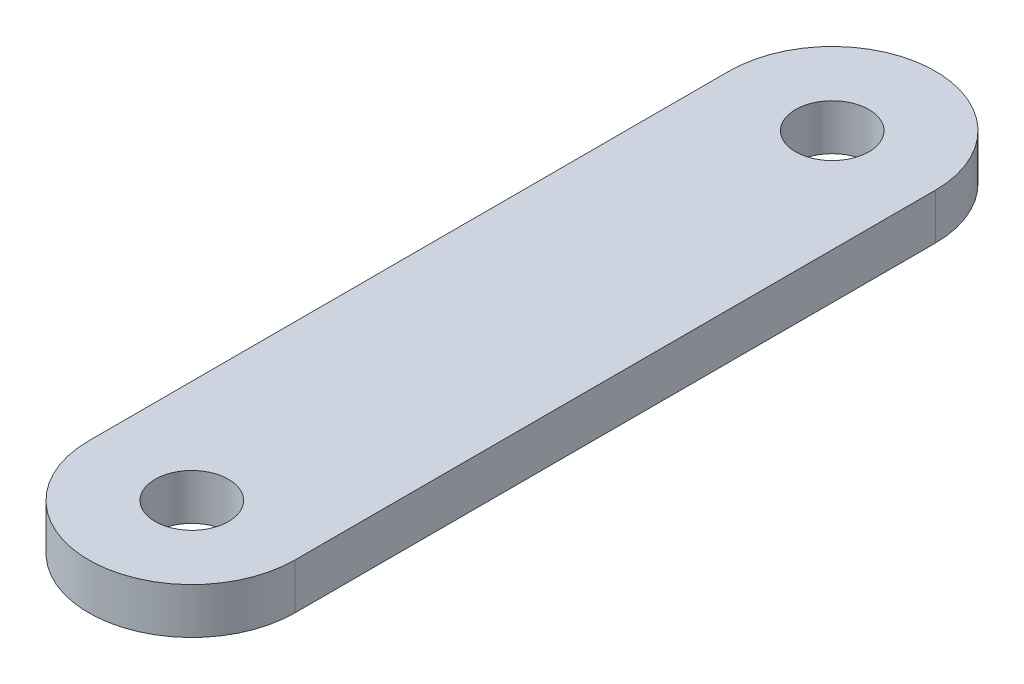
ISO-10303-21;
HEADER;
FILE_DESCRIPTION(('STEP AP214'),'2;1');
FILE_NAME('part.step','',(''),(''),'','','');
FILE_SCHEMA(('AUTOMOTIVE_DESIGN { 1 0 10303 214 1 1 1 1 }'));
ENDSEC;
DATA;
#1=APPLICATION_CONTEXT('core data for automotive mechanical design processes');
#2=APPLICATION_PROTOCOL_DEFINITION('international standard','automotive_design',2000,#1);
#3=PRODUCT_CONTEXT('',#1,'mechanical');
#4=PRODUCT('Part','Part','',(#3));
#5=PRODUCT_RELATED_PRODUCT_CATEGORY('part','',(#4));
#6=PRODUCT_DEFINITION_FORMATION('','',#4);
#7=PRODUCT_DEFINITION_CONTEXT('part definition',#1,'design');
#8=PRODUCT_DEFINITION('design','',#6,#7);
#9=PRODUCT_DEFINITION_SHAPE('','',#8);
#10=(LENGTH_UNIT() NAMED_UNIT(*) SI_UNIT(.MILLI.,.METRE.));
#11=(NAMED_UNIT(*) PLANE_ANGLE_UNIT() SI_UNIT($,.RADIAN.));
#12=(NAMED_UNIT(*) SI_UNIT($,.STERADIAN.) SOLID_ANGLE_UNIT());
#13=UNCERTAINTY_MEASURE_WITH_UNIT(LENGTH_MEASURE(1.E-05),#10,'distance_accuracy_value','');
#14=(GEOMETRIC_REPRESENTATION_CONTEXT(3) GLOBAL_UNCERTAINTY_ASSIGNED_CONTEXT((#13)) GLOBAL_UNIT_ASSIGNED_CONTEXT((#10,
#11,#12)) REPRESENTATION_CONTEXT('',''));
#15=CARTESIAN_POINT('',(0.,0.,0.));
#16=DIRECTION('',(0.,0.,1.));
#17=DIRECTION('',(1.,0.,0.));
#18=AXIS2_PLACEMENT_3D('',#15,#16,#17);
#19=CARTESIAN_POINT('',(0.,2.,27.94));
#20=DIRECTION('',(0.,-1.,0.));
#21=DIRECTION('',(0.,0.,-1.));
#22=AXIS2_PLACEMENT_3D('',#19,#20,#21);
#23=CYLINDRICAL_SURFACE('',#22,4.5);
#24=CARTESIAN_POINT('',(0.,0.,27.94));
#25=DIRECTION('',(0.,1.,0.));
#26=DIRECTION('',(0.,0.,1.));
#27=AXIS2_PLACEMENT_3D('',#24,#25,#26);
#28=CIRCLE('',#27,4.5);
#29=CARTESIAN_POINT('',(-4.5,0.,27.94));
#30=VERTEX_POINT('',#29);
#31=CARTESIAN_POINT('',(4.50000000000001,0.,27.94));
#32=VERTEX_POINT('',#31);
#33=EDGE_CURVE('E105',#30,#32,#28,.T.);
#34=ORIENTED_EDGE('',*,*,#33,.T.);
#35=DIRECTION('',(0.,-1.,0.));
#36=VECTOR('',#35,1.);
#37=CARTESIAN_POINT('',(4.50000000000001,2.,27.94));
#38=LINE('',#37,#36);
#39=CARTESIAN_POINT('',(4.50000000000001,2.,27.94));
#40=VERTEX_POINT('',#39);
#41=EDGE_CURVE('E60',#40,#32,#38,.T.);
#42=ORIENTED_EDGE('',*,*,#41,.F.);
#43=CARTESIAN_POINT('',(0.,2.,27.94));
#44=DIRECTION('',(0.,1.,0.));
#45=DIRECTION('',(0.,0.,1.));
#46=AXIS2_PLACEMENT_3D('',#43,#44,#45);
#47=CIRCLE('',#46,4.5);
#48=CARTESIAN_POINT('',(-4.5,2.,27.94));
#49=VERTEX_POINT('',#48);
#50=EDGE_CURVE('E94',#49,#40,#47,.T.);
#51=ORIENTED_EDGE('',*,*,#50,.F.);
#52=DIRECTION('',(0.,-1.,0.));
#53=VECTOR('',#52,1.);
#54=CARTESIAN_POINT('',(-4.5,2.,27.94));
#55=LINE('',#54,#53);
#56=EDGE_CURVE('E12',#49,#30,#55,.T.);
#57=ORIENTED_EDGE('',*,*,#56,.T.);
#58=EDGE_LOOP('',(#34,#42,#51,#57));
#59=FACE_BOUND('',#58,.T.);
#60=ADVANCED_FACE('F50',(#59),#23,.T.);
#61=CARTESIAN_POINT('',(4.50000000000001,2.,0.));
#62=DIRECTION('',(1.,0.,0.));
#63=DIRECTION('',(0.,0.,-1.));
#64=AXIS2_PLACEMENT_3D('',#61,#62,#63);
#65=PLANE('',#64);
#66=DIRECTION('',(0.,0.,1.));
#67=VECTOR('',#66,1.);
#68=CARTESIAN_POINT('',(4.50000000000001,0.,0.));
#69=LINE('',#68,#67);
#70=CARTESIAN_POINT('',(4.50000000000001,0.,0.));
#71=VERTEX_POINT('',#70);
#72=EDGE_CURVE('E119',#71,#32,#69,.T.);
#73=ORIENTED_EDGE('',*,*,#72,.F.);
#74=DIRECTION('',(0.,-1.,0.));
#75=VECTOR('',#74,1.);
#76=CARTESIAN_POINT('',(4.50000000000001,2.,0.));
#77=LINE('',#76,#75);
#78=CARTESIAN_POINT('',(4.50000000000001,2.,0.));
#79=VERTEX_POINT('',#78);
#80=EDGE_CURVE('E83',#79,#71,#77,.T.);
#81=ORIENTED_EDGE('',*,*,#80,.F.);
#82=DIRECTION('',(0.,0.,1.));
#83=VECTOR('',#82,1.);
#84=CARTESIAN_POINT('',(4.50000000000001,2.,0.));
#85=LINE('',#84,#83);
#86=EDGE_CURVE('E100',#79,#40,#85,.T.);
#87=ORIENTED_EDGE('',*,*,#86,.T.);
#88=ORIENTED_EDGE('',*,*,#41,.T.);
#89=EDGE_LOOP('',(#73,#81,#87,#88));
#90=FACE_BOUND('',#89,.T.);
#91=ADVANCED_FACE('F110',(#90),#65,.T.);
#92=CARTESIAN_POINT('',(-4.5,2.,0.));
#93=DIRECTION('',(1.,0.,0.));
#94=DIRECTION('',(0.,0.,-1.));
#95=AXIS2_PLACEMENT_3D('',#92,#93,#94);
#96=PLANE('',#95);
#97=DIRECTION('',(0.,0.,1.));
#98=VECTOR('',#97,1.);
#99=CARTESIAN_POINT('',(-4.5,0.,0.));
#100=LINE('',#99,#98);
#101=CARTESIAN_POINT('',(-4.5,0.,0.));
#102=VERTEX_POINT('',#101);
#103=EDGE_CURVE('E115',#102,#30,#100,.T.);
#104=ORIENTED_EDGE('',*,*,#103,.T.);
#105=ORIENTED_EDGE('',*,*,#56,.F.);
#106=DIRECTION('',(0.,0.,1.));
#107=VECTOR('',#106,1.);
#108=CARTESIAN_POINT('',(-4.5,2.,0.));
#109=LINE('',#108,#107);
#110=CARTESIAN_POINT('',(-4.5,2.,0.));
#111=VERTEX_POINT('',#110);
#112=EDGE_CURVE('E101',#111,#49,#109,.T.);
#113=ORIENTED_EDGE('',*,*,#112,.F.);
#114=DIRECTION('',(0.,-1.,0.));
#115=VECTOR('',#114,1.);
#116=CARTESIAN_POINT('',(-4.5,2.,0.));
#117=LINE('',#116,#115);
#118=EDGE_CURVE('E69',#111,#102,#117,.T.);
#119=ORIENTED_EDGE('',*,*,#118,.T.);
#120=EDGE_LOOP('',(#104,#105,#113,#119));
#121=FACE_BOUND('',#120,.T.);
#122=ADVANCED_FACE('F155',(#121),#96,.F.);
#123=CARTESIAN_POINT('',(0.,0.,0.));
#124=DIRECTION('',(0.,1.,0.));
#125=DIRECTION('',(0.,0.,1.));
#126=AXIS2_PLACEMENT_3D('',#123,#124,#125);
#127=PLANE('',#126);
#128=CARTESIAN_POINT('',(0.,0.,0.));
#129=DIRECTION('',(0.,1.,0.));
#130=DIRECTION('',(0.,0.,1.));
#131=AXIS2_PLACEMENT_3D('',#128,#129,#130);
#132=CIRCLE('',#131,1.6);
#133=CARTESIAN_POINT('',(0.,0.,1.6));
#134=VERTEX_POINT('',#133);
#135=EDGE_CURVE('E121',#134,#134,#132,.T.);
#136=ORIENTED_EDGE('',*,*,#135,.T.);
#137=EDGE_LOOP('',(#136));
#138=FACE_BOUND('',#137,.T.);
#139=CARTESIAN_POINT('',(0.,0.,27.94));
#140=DIRECTION('',(0.,1.,0.));
#141=DIRECTION('',(0.,0.,1.));
#142=AXIS2_PLACEMENT_3D('',#139,#140,#141);
#143=CIRCLE('',#142,1.6);
#144=CARTESIAN_POINT('',(0.,0.,29.54));
#145=VERTEX_POINT('',#144);
#146=EDGE_CURVE('E124',#145,#145,#143,.T.);
#147=ORIENTED_EDGE('',*,*,#146,.T.);
#148=EDGE_LOOP('',(#147));
#149=FACE_BOUND('',#148,.T.);
#150=ORIENTED_EDGE('',*,*,#103,.F.);
#151=CARTESIAN_POINT('',(0.,0.,0.));
#152=DIRECTION('',(0.,1.,0.));
#153=DIRECTION('',(0.,0.,1.));
#154=AXIS2_PLACEMENT_3D('',#151,#152,#153);
#155=CIRCLE('',#154,4.5);
#156=EDGE_CURVE('E54',#71,#102,#155,.T.);
#157=ORIENTED_EDGE('',*,*,#156,.F.);
#158=ORIENTED_EDGE('',*,*,#72,.T.);
#159=ORIENTED_EDGE('',*,*,#33,.F.);
#160=EDGE_LOOP('',(#150,#157,#158,#159));
#161=FACE_BOUND('',#160,.T.);
#162=ADVANCED_FACE('F143',(#138,#149,#161),#127,.F.);
#163=CARTESIAN_POINT('',(0.,2.,0.));
#164=DIRECTION('',(0.,1.,0.));
#165=DIRECTION('',(0.,0.,1.));
#166=AXIS2_PLACEMENT_3D('',#163,#164,#165);
#167=PLANE('',#166);
#168=CARTESIAN_POINT('',(0.,2.,0.));
#169=DIRECTION('',(0.,1.,0.));
#170=DIRECTION('',(0.,0.,1.));
#171=AXIS2_PLACEMENT_3D('',#168,#169,#170);
#172=CIRCLE('',#171,1.6);
#173=CARTESIAN_POINT('',(0.,2.,1.6));
#174=VERTEX_POINT('',#173);
#175=EDGE_CURVE('E129',#174,#174,#172,.T.);
#176=ORIENTED_EDGE('',*,*,#175,.F.);
#177=EDGE_LOOP('',(#176));
#178=FACE_BOUND('',#177,.T.);
#179=CARTESIAN_POINT('',(0.,2.,27.94));
#180=DIRECTION('',(0.,1.,0.));
#181=DIRECTION('',(0.,0.,1.));
#182=AXIS2_PLACEMENT_3D('',#179,#180,#181);
#183=CIRCLE('',#182,1.6);
#184=CARTESIAN_POINT('',(0.,2.,29.54));
#185=VERTEX_POINT('',#184);
#186=EDGE_CURVE('E132',#185,#185,#183,.T.);
#187=ORIENTED_EDGE('',*,*,#186,.F.);
#188=EDGE_LOOP('',(#187));
#189=FACE_BOUND('',#188,.T.);
#190=ORIENTED_EDGE('',*,*,#112,.T.);
#191=ORIENTED_EDGE('',*,*,#50,.T.);
#192=ORIENTED_EDGE('',*,*,#86,.F.);
#193=CARTESIAN_POINT('',(0.,2.,0.));
#194=DIRECTION('',(0.,1.,0.));
#195=DIRECTION('',(0.,0.,1.));
#196=AXIS2_PLACEMENT_3D('',#193,#194,#195);
#197=CIRCLE('',#196,4.5);
#198=EDGE_CURVE('E117',#79,#111,#197,.T.);
#199=ORIENTED_EDGE('',*,*,#198,.T.);
#200=EDGE_LOOP('',(#190,#191,#192,#199));
#201=FACE_BOUND('',#200,.T.);
#202=ADVANCED_FACE('F98',(#178,#189,#201),#167,.T.);
#203=CARTESIAN_POINT('',(0.,2.,0.));
#204=DIRECTION('',(0.,-1.,0.));
#205=DIRECTION('',(0.,0.,-1.));
#206=AXIS2_PLACEMENT_3D('',#203,#204,#205);
#207=CYLINDRICAL_SURFACE('',#206,4.5);
#208=ORIENTED_EDGE('',*,*,#156,.T.);
#209=ORIENTED_EDGE('',*,*,#118,.F.);
#210=ORIENTED_EDGE('',*,*,#198,.F.);
#211=ORIENTED_EDGE('',*,*,#80,.T.);
#212=EDGE_LOOP('',(#208,#209,#210,#211));
#213=FACE_BOUND('',#212,.T.);
#214=ADVANCED_FACE('F52',(#213),#207,.T.);
#215=CARTESIAN_POINT('',(0.,-8.,27.94));
#216=DIRECTION('',(0.,1.,0.));
#217=DIRECTION('',(0.,0.,1.));
#218=AXIS2_PLACEMENT_3D('',#215,#216,#217);
#219=CYLINDRICAL_SURFACE('',#218,1.6);
#220=ORIENTED_EDGE('',*,*,#186,.T.);
#221=EDGE_LOOP('',(#220));
#222=FACE_BOUND('',#221,.T.);
#223=ORIENTED_EDGE('',*,*,#146,.F.);
#224=EDGE_LOOP('',(#223));
#225=FACE_BOUND('',#224,.T.);
#226=ADVANCED_FACE('F147',(#222,#225),#219,.F.);
#227=CARTESIAN_POINT('',(0.,-8.,0.));
#228=DIRECTION('',(0.,1.,0.));
#229=DIRECTION('',(0.,0.,1.));
#230=AXIS2_PLACEMENT_3D('',#227,#228,#229);
#231=CYLINDRICAL_SURFACE('',#230,1.6);
#232=ORIENTED_EDGE('',*,*,#175,.T.);
#233=EDGE_LOOP('',(#232));
#234=FACE_BOUND('',#233,.T.);
#235=ORIENTED_EDGE('',*,*,#135,.F.);
#236=EDGE_LOOP('',(#235));
#237=FACE_BOUND('',#236,.T.);
#238=ADVANCED_FACE('F138',(#234,#237),#231,.F.);
#239=CLOSED_SHELL('',(#60,#91,#122,#162,#202,#214,#226,#238));
#240=MANIFOLD_SOLID_BREP('B2',#239);
#241=ADVANCED_BREP_SHAPE_REPRESENTATION('',(#18,#240),#14);
#242=SHAPE_DEFINITION_REPRESENTATION(#9,#241);
ENDSEC;
END-ISO-10303-21;
